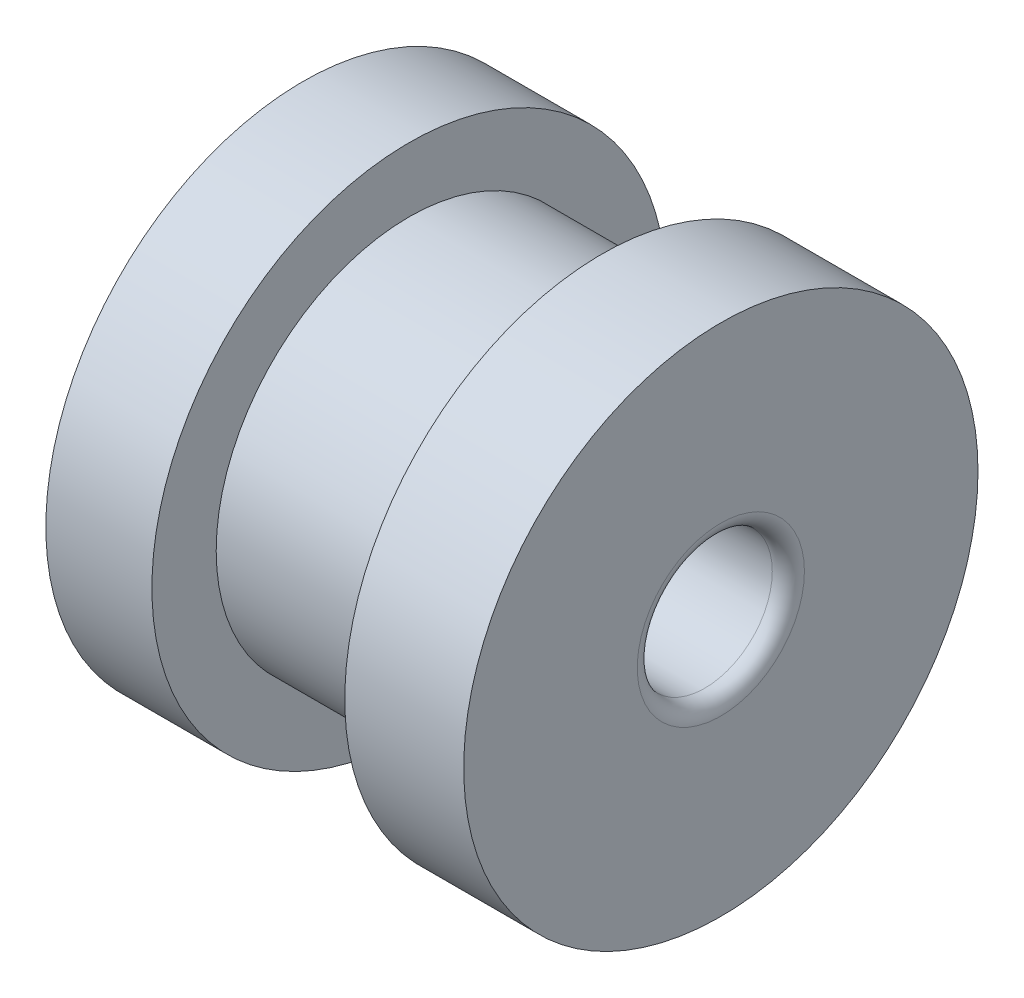
ISO-10303-21;
HEADER;
FILE_DESCRIPTION(('STEP AP214'),'2;1');
FILE_NAME('part.step','',(''),(''),'','','');
FILE_SCHEMA(('AUTOMOTIVE_DESIGN { 1 0 10303 214 1 1 1 1 }'));
ENDSEC;
DATA;
#1=APPLICATION_CONTEXT('core data for automotive mechanical design processes');
#2=APPLICATION_PROTOCOL_DEFINITION('international standard','automotive_design',2000,#1);
#3=PRODUCT_CONTEXT('',#1,'mechanical');
#4=PRODUCT('Part','Part','',(#3));
#5=PRODUCT_RELATED_PRODUCT_CATEGORY('part','',(#4));
#6=PRODUCT_DEFINITION_FORMATION('','',#4);
#7=PRODUCT_DEFINITION_CONTEXT('part definition',#1,'design');
#8=PRODUCT_DEFINITION('design','',#6,#7);
#9=PRODUCT_DEFINITION_SHAPE('','',#8);
#10=(LENGTH_UNIT() NAMED_UNIT(*) SI_UNIT(.MILLI.,.METRE.));
#11=(NAMED_UNIT(*) PLANE_ANGLE_UNIT() SI_UNIT($,.RADIAN.));
#12=(NAMED_UNIT(*) SI_UNIT($,.STERADIAN.) SOLID_ANGLE_UNIT());
#13=UNCERTAINTY_MEASURE_WITH_UNIT(LENGTH_MEASURE(1.E-05),#10,'distance_accuracy_value','');
#14=(GEOMETRIC_REPRESENTATION_CONTEXT(3) GLOBAL_UNCERTAINTY_ASSIGNED_CONTEXT((#13)) GLOBAL_UNIT_ASSIGNED_CONTEXT((#10,
#11,#12)) REPRESENTATION_CONTEXT('',''));
#15=CARTESIAN_POINT('',(0.,0.,0.));
#16=DIRECTION('',(0.,0.,1.));
#17=DIRECTION('',(1.,0.,0.));
#18=AXIS2_PLACEMENT_3D('',#15,#16,#17);
#19=CARTESIAN_POINT('',(-13.,0.,0.));
#20=DIRECTION('',(1.,0.,0.));
#21=DIRECTION('',(0.,0.,-1.));
#22=AXIS2_PLACEMENT_3D('',#19,#20,#21);
#23=CYLINDRICAL_SURFACE('',#22,8.);
#24=CARTESIAN_POINT('',(-13.,0.,0.));
#25=DIRECTION('',(1.,0.,0.));
#26=DIRECTION('',(0.,0.,-1.));
#27=AXIS2_PLACEMENT_3D('',#24,#25,#26);
#28=CIRCLE('',#27,8.);
#29=CARTESIAN_POINT('',(-13.,0.,-8.));
#30=VERTEX_POINT('',#29);
#31=EDGE_CURVE('E49',#30,#30,#28,.T.);
#32=CARTESIAN_POINT('',(-9.7,0.,0.));
#33=DIRECTION('',(-1.,0.,0.));
#34=DIRECTION('',(0.,0.,1.));
#35=AXIS2_PLACEMENT_3D('',#32,#33,#34);
#36=CIRCLE('',#35,8.);
#37=CARTESIAN_POINT('',(-9.7,0.,-8.));
#38=VERTEX_POINT('',#37);
#39=EDGE_CURVE('E64',#38,#38,#36,.T.);
#40=CARTESIAN_POINT('',(-13.,0.,-8.));
#41=CARTESIAN_POINT('',(-12.965625,0.,-8.));
#42=CARTESIAN_POINT('',(-12.93125,0.,-8.));
#43=CARTESIAN_POINT('',(-12.8625,0.,-8.));
#44=CARTESIAN_POINT('',(-12.828125,0.,-8.));
#45=CARTESIAN_POINT('',(-12.759375,0.,-8.));
#46=CARTESIAN_POINT('',(-12.725,0.,-8.));
#47=CARTESIAN_POINT('',(-12.65625,0.,-8.));
#48=CARTESIAN_POINT('',(-12.621875,0.,-8.));
#49=CARTESIAN_POINT('',(-12.553125,0.,-8.));
#50=CARTESIAN_POINT('',(-12.51875,0.,-8.));
#51=CARTESIAN_POINT('',(-12.45,0.,-8.));
#52=CARTESIAN_POINT('',(-12.415625,0.,-8.));
#53=CARTESIAN_POINT('',(-12.346875,0.,-8.));
#54=CARTESIAN_POINT('',(-12.3125,0.,-8.));
#55=CARTESIAN_POINT('',(-12.24375,0.,-8.));
#56=CARTESIAN_POINT('',(-12.209375,0.,-8.));
#57=CARTESIAN_POINT('',(-12.140625,0.,-8.));
#58=CARTESIAN_POINT('',(-12.10625,0.,-8.));
#59=CARTESIAN_POINT('',(-12.0375,0.,-8.));
#60=CARTESIAN_POINT('',(-12.003125,0.,-8.));
#61=CARTESIAN_POINT('',(-11.934375,0.,-8.));
#62=CARTESIAN_POINT('',(-11.9,0.,-8.));
#63=CARTESIAN_POINT('',(-11.83125,0.,-8.));
#64=CARTESIAN_POINT('',(-11.796875,0.,-8.));
#65=CARTESIAN_POINT('',(-11.728125,0.,-8.));
#66=CARTESIAN_POINT('',(-11.69375,0.,-8.));
#67=CARTESIAN_POINT('',(-11.625,0.,-8.));
#68=CARTESIAN_POINT('',(-11.590625,0.,-8.));
#69=CARTESIAN_POINT('',(-11.521875,0.,-8.));
#70=CARTESIAN_POINT('',(-11.4875,0.,-8.));
#71=CARTESIAN_POINT('',(-11.41875,0.,-8.));
#72=CARTESIAN_POINT('',(-11.384375,0.,-8.));
#73=CARTESIAN_POINT('',(-11.315625,0.,-8.));
#74=CARTESIAN_POINT('',(-11.28125,0.,-8.));
#75=CARTESIAN_POINT('',(-11.2125,0.,-8.));
#76=CARTESIAN_POINT('',(-11.178125,0.,-8.));
#77=CARTESIAN_POINT('',(-11.109375,0.,-8.));
#78=CARTESIAN_POINT('',(-11.075,0.,-8.));
#79=CARTESIAN_POINT('',(-11.00625,0.,-8.));
#80=CARTESIAN_POINT('',(-10.971875,0.,-8.));
#81=CARTESIAN_POINT('',(-10.903125,0.,-8.));
#82=CARTESIAN_POINT('',(-10.86875,0.,-8.));
#83=CARTESIAN_POINT('',(-10.8,0.,-8.));
#84=CARTESIAN_POINT('',(-10.765625,0.,-8.));
#85=CARTESIAN_POINT('',(-10.696875,0.,-8.));
#86=CARTESIAN_POINT('',(-10.6625,0.,-8.));
#87=CARTESIAN_POINT('',(-10.59375,0.,-8.));
#88=CARTESIAN_POINT('',(-10.559375,0.,-8.));
#89=CARTESIAN_POINT('',(-10.490625,0.,-8.));
#90=CARTESIAN_POINT('',(-10.45625,0.,-8.));
#91=CARTESIAN_POINT('',(-10.3875,0.,-8.));
#92=CARTESIAN_POINT('',(-10.353125,0.,-8.));
#93=CARTESIAN_POINT('',(-10.284375,0.,-8.));
#94=CARTESIAN_POINT('',(-10.25,0.,-8.));
#95=CARTESIAN_POINT('',(-10.18125,0.,-8.));
#96=CARTESIAN_POINT('',(-10.146875,0.,-8.));
#97=CARTESIAN_POINT('',(-10.078125,0.,-8.));
#98=CARTESIAN_POINT('',(-10.04375,0.,-8.));
#99=CARTESIAN_POINT('',(-9.975,0.,-8.));
#100=CARTESIAN_POINT('',(-9.940625,0.,-8.));
#101=CARTESIAN_POINT('',(-9.871875,0.,-8.));
#102=CARTESIAN_POINT('',(-9.8375,0.,-8.));
#103=CARTESIAN_POINT('',(-9.76875,0.,-8.));
#104=CARTESIAN_POINT('',(-9.734375,0.,-8.));
#105=CARTESIAN_POINT('',(-9.7,0.,-8.));
#106=B_SPLINE_CURVE_WITH_KNOTS('',3,(#40,#41,#42,#43,#44,#45,#46,#47,#48,#49,#50,#51,#52,#53,
#54,#55,#56,#57,#58,#59,#60,#61,#62,#63,#64,#65,#66,#67,#68,#69,#70,#71,#72,#73,#74,#75,#76,#77,
#78,#79,#80,#81,#82,#83,#84,#85,#86,#87,#88,#89,#90,#91,#92,#93,#94,#95,#96,#97,#98,#99,#100,
#101,#102,#103,#104,#105),.UNSPECIFIED.,.F.,.F.,(4,2,2,2,2,2,2,2,2,2,2,2,2,2,2,2,2,2,2,2,2,2,2,
2,2,2,2,2,2,2,2,2,4),(0.,0.103124999999999,0.20625,0.309374999999999,0.4125,0.515624999999999,
0.618749999999999,0.721874999999999,0.824999999999999,0.928125,1.03125,1.134375,1.2375,1.340625,
1.44375,1.546875,1.65,1.753125,1.85625,1.959375,2.0625,2.165625,2.26875,2.371875,2.475,2.578125,
2.68125,2.784375,2.8875,2.990625,3.09375,3.196875,3.3),.UNSPECIFIED.);
#107=EDGE_CURVE('BSEAM29',#30,#38,#106,.T.);
#108=ORIENTED_EDGE('',*,*,#31,.T.);
#109=ORIENTED_EDGE('',*,*,#39,.T.);
#110=ORIENTED_EDGE('',*,*,#107,.T.);
#111=ORIENTED_EDGE('',*,*,#107,.F.);
#112=EDGE_LOOP('',(#108,#110,#109,#111));
#113=FACE_BOUND('',#112,.T.);
#114=ADVANCED_FACE('F29',(#113),#23,.T.);
#115=CARTESIAN_POINT('',(0.,0.,0.));
#116=DIRECTION('',(1.,0.,0.));
#117=DIRECTION('',(0.,0.,-1.));
#118=AXIS2_PLACEMENT_3D('',#115,#116,#117);
#119=CIRCLE('',#118,8.);
#120=CARTESIAN_POINT('',(0.,0.,-8.));
#121=VERTEX_POINT('',#120);
#122=EDGE_CURVE('E50',#121,#121,#119,.T.);
#123=CARTESIAN_POINT('',(-3.7,0.,0.));
#124=DIRECTION('',(-1.,0.,0.));
#125=DIRECTION('',(0.,0.,1.));
#126=AXIS2_PLACEMENT_3D('',#123,#124,#125);
#127=CIRCLE('',#126,8.);
#128=CARTESIAN_POINT('',(-3.7,0.,-8.));
#129=VERTEX_POINT('',#128);
#130=EDGE_CURVE('E61',#129,#129,#127,.T.);
#131=CARTESIAN_POINT('',(0.,0.,-8.));
#132=CARTESIAN_POINT('',(-0.0385416666666665,0.,-8.));
#133=CARTESIAN_POINT('',(-0.0770833333333329,0.,-8.));
#134=CARTESIAN_POINT('',(-0.154166666666666,0.,-8.));
#135=CARTESIAN_POINT('',(-0.192708333333334,0.,-8.));
#136=CARTESIAN_POINT('',(-0.269791666666667,0.,-8.));
#137=CARTESIAN_POINT('',(-0.308333333333334,0.,-8.));
#138=CARTESIAN_POINT('',(-0.385416666666666,0.,-8.));
#139=CARTESIAN_POINT('',(-0.423958333333333,0.,-8.));
#140=CARTESIAN_POINT('',(-0.501041666666666,0.,-8.));
#141=CARTESIAN_POINT('',(-0.539583333333333,0.,-8.));
#142=CARTESIAN_POINT('',(-0.616666666666667,0.,-8.));
#143=CARTESIAN_POINT('',(-0.655208333333334,0.,-8.));
#144=CARTESIAN_POINT('',(-0.732291666666666,0.,-8.));
#145=CARTESIAN_POINT('',(-0.770833333333333,0.,-8.));
#146=CARTESIAN_POINT('',(-0.847916666666666,0.,-8.));
#147=CARTESIAN_POINT('',(-0.886458333333332,0.,-8.));
#148=CARTESIAN_POINT('',(-0.963541666666666,0.,-8.));
#149=CARTESIAN_POINT('',(-1.00208333333333,0.,-8.));
#150=CARTESIAN_POINT('',(-1.07916666666667,0.,-8.));
#151=CARTESIAN_POINT('',(-1.11770833333333,0.,-8.));
#152=CARTESIAN_POINT('',(-1.19479166666667,0.,-8.));
#153=CARTESIAN_POINT('',(-1.23333333333333,0.,-8.));
#154=CARTESIAN_POINT('',(-1.31041666666667,0.,-8.));
#155=CARTESIAN_POINT('',(-1.34895833333333,0.,-8.));
#156=CARTESIAN_POINT('',(-1.42604166666667,0.,-8.));
#157=CARTESIAN_POINT('',(-1.46458333333333,0.,-8.));
#158=CARTESIAN_POINT('',(-1.54166666666667,0.,-8.));
#159=CARTESIAN_POINT('',(-1.58020833333333,0.,-8.));
#160=CARTESIAN_POINT('',(-1.65729166666667,0.,-8.));
#161=CARTESIAN_POINT('',(-1.69583333333333,0.,-8.));
#162=CARTESIAN_POINT('',(-1.77291666666667,0.,-8.));
#163=CARTESIAN_POINT('',(-1.81145833333333,0.,-8.));
#164=CARTESIAN_POINT('',(-1.88854166666667,0.,-8.));
#165=CARTESIAN_POINT('',(-1.92708333333333,0.,-8.));
#166=CARTESIAN_POINT('',(-2.00416666666667,0.,-8.));
#167=CARTESIAN_POINT('',(-2.04270833333333,0.,-8.));
#168=CARTESIAN_POINT('',(-2.11979166666667,0.,-8.));
#169=CARTESIAN_POINT('',(-2.15833333333333,0.,-8.));
#170=CARTESIAN_POINT('',(-2.23541666666667,0.,-8.));
#171=CARTESIAN_POINT('',(-2.27395833333333,0.,-8.));
#172=CARTESIAN_POINT('',(-2.35104166666667,0.,-8.));
#173=CARTESIAN_POINT('',(-2.38958333333333,0.,-8.));
#174=CARTESIAN_POINT('',(-2.46666666666667,0.,-8.));
#175=CARTESIAN_POINT('',(-2.50520833333333,0.,-8.));
#176=CARTESIAN_POINT('',(-2.58229166666667,0.,-8.));
#177=CARTESIAN_POINT('',(-2.62083333333333,0.,-8.));
#178=CARTESIAN_POINT('',(-2.69791666666667,0.,-8.));
#179=CARTESIAN_POINT('',(-2.73645833333333,0.,-8.));
#180=CARTESIAN_POINT('',(-2.81354166666667,0.,-8.));
#181=CARTESIAN_POINT('',(-2.85208333333333,0.,-8.));
#182=CARTESIAN_POINT('',(-2.92916666666667,0.,-8.));
#183=CARTESIAN_POINT('',(-2.96770833333333,0.,-8.));
#184=CARTESIAN_POINT('',(-3.04479166666667,0.,-8.));
#185=CARTESIAN_POINT('',(-3.08333333333333,0.,-8.));
#186=CARTESIAN_POINT('',(-3.16041666666667,0.,-8.));
#187=CARTESIAN_POINT('',(-3.19895833333333,0.,-8.));
#188=CARTESIAN_POINT('',(-3.27604166666667,0.,-8.));
#189=CARTESIAN_POINT('',(-3.31458333333333,0.,-8.));
#190=CARTESIAN_POINT('',(-3.39166666666667,0.,-8.));
#191=CARTESIAN_POINT('',(-3.43020833333333,0.,-8.));
#192=CARTESIAN_POINT('',(-3.50729166666667,0.,-8.));
#193=CARTESIAN_POINT('',(-3.54583333333333,0.,-8.));
#194=CARTESIAN_POINT('',(-3.62291666666667,0.,-8.));
#195=CARTESIAN_POINT('',(-3.66145833333333,0.,-8.));
#196=CARTESIAN_POINT('',(-3.7,0.,-8.));
#197=B_SPLINE_CURVE_WITH_KNOTS('',3,(#131,#132,#133,#134,#135,#136,#137,#138,#139,#140,#141,
#142,#143,#144,#145,#146,#147,#148,#149,#150,#151,#152,#153,#154,#155,#156,#157,#158,#159,#160,
#161,#162,#163,#164,#165,#166,#167,#168,#169,#170,#171,#172,#173,#174,#175,#176,#177,#178,#179,
#180,#181,#182,#183,#184,#185,#186,#187,#188,#189,#190,#191,#192,#193,#194,#195,#196),
.UNSPECIFIED.,.F.,.F.,(4,2,2,2,2,2,2,2,2,2,2,2,2,2,2,2,2,2,2,2,2,2,2,2,2,2,2,2,2,2,2,2,4),(0.,
0.115624999999999,0.231250000000001,0.346875,0.462499999999999,0.578125000000001,0.69375,
0.809374999999999,0.924999999999999,1.040625,1.15625,1.271875,1.3875,1.503125,1.61875,1.734375,
1.85,1.965625,2.08125,2.196875,2.3125,2.428125,2.54375,2.659375,2.775,2.890625,3.00625,3.121875,
3.2375,3.353125,3.46875,3.584375,3.7),.UNSPECIFIED.);
#198=EDGE_CURVE('BSEAM85',#121,#129,#197,.T.);
#199=ORIENTED_EDGE('',*,*,#122,.F.);
#200=ORIENTED_EDGE('',*,*,#130,.F.);
#201=ORIENTED_EDGE('',*,*,#198,.T.);
#202=ORIENTED_EDGE('',*,*,#198,.F.);
#203=EDGE_LOOP('',(#199,#201,#200,#202));
#204=FACE_BOUND('',#203,.T.);
#205=ADVANCED_FACE('F85',(#204),#23,.T.);
#206=CARTESIAN_POINT('',(-13.,0.,0.));
#207=DIRECTION('',(1.,0.,0.));
#208=DIRECTION('',(0.,0.,-1.));
#209=AXIS2_PLACEMENT_3D('',#206,#207,#208);
#210=PLANE('',#209);
#211=CARTESIAN_POINT('',(-13.,0.,0.));
#212=DIRECTION('',(1.,0.,0.));
#213=DIRECTION('',(0.,0.,-1.));
#214=AXIS2_PLACEMENT_3D('',#211,#212,#213);
#215=CIRCLE('',#214,2.6);
#216=CARTESIAN_POINT('',(-13.,0.,-2.6));
#217=VERTEX_POINT('',#216);
#218=EDGE_CURVE('E10',#217,#217,#215,.T.);
#219=ORIENTED_EDGE('',*,*,#218,.T.);
#220=EDGE_LOOP('',(#219));
#221=FACE_BOUND('',#220,.T.);
#222=ORIENTED_EDGE('',*,*,#31,.F.);
#223=EDGE_LOOP('',(#222));
#224=FACE_BOUND('',#223,.T.);
#225=ADVANCED_FACE('F91',(#221,#224),#210,.F.);
#226=CARTESIAN_POINT('',(0.,0.,0.));
#227=DIRECTION('',(1.,0.,0.));
#228=DIRECTION('',(0.,0.,-1.));
#229=AXIS2_PLACEMENT_3D('',#226,#227,#228);
#230=PLANE('',#229);
#231=CARTESIAN_POINT('',(0.,0.,0.));
#232=DIRECTION('',(1.,0.,0.));
#233=DIRECTION('',(0.,0.,-1.));
#234=AXIS2_PLACEMENT_3D('',#231,#232,#233);
#235=CIRCLE('',#234,2.6);
#236=CARTESIAN_POINT('',(0.,0.,-2.6));
#237=VERTEX_POINT('',#236);
#238=EDGE_CURVE('E36',#237,#237,#235,.F.);
#239=ORIENTED_EDGE('',*,*,#238,.T.);
#240=EDGE_LOOP('',(#239));
#241=FACE_BOUND('',#240,.T.);
#242=ORIENTED_EDGE('',*,*,#122,.T.);
#243=EDGE_LOOP('',(#242));
#244=FACE_BOUND('',#243,.T.);
#245=ADVANCED_FACE('F94',(#241,#244),#230,.T.);
#246=CARTESIAN_POINT('',(-13.,0.,0.));
#247=DIRECTION('',(1.,0.,0.));
#248=DIRECTION('',(0.,0.,-1.));
#249=AXIS2_PLACEMENT_3D('',#246,#247,#248);
#250=CYLINDRICAL_SURFACE('',#249,2.1);
#251=CARTESIAN_POINT('',(-0.5,0.,0.));
#252=DIRECTION('',(1.,0.,0.));
#253=DIRECTION('',(0.,0.,-1.));
#254=AXIS2_PLACEMENT_3D('',#251,#252,#253);
#255=CIRCLE('',#254,2.1);
#256=CARTESIAN_POINT('',(-0.5,0.,-2.1));
#257=VERTEX_POINT('',#256);
#258=EDGE_CURVE('E40',#257,#257,#255,.T.);
#259=CARTESIAN_POINT('',(-12.5,0.,0.));
#260=DIRECTION('',(1.,0.,0.));
#261=DIRECTION('',(0.,0.,-1.));
#262=AXIS2_PLACEMENT_3D('',#259,#260,#261);
#263=CIRCLE('',#262,2.1);
#264=CARTESIAN_POINT('',(-12.5,0.,-2.1));
#265=VERTEX_POINT('',#264);
#266=EDGE_CURVE('E44',#265,#265,#263,.F.);
#267=CARTESIAN_POINT('',(-0.5,0.,-2.1));
#268=CARTESIAN_POINT('',(-0.625000000000001,0.,-2.1));
#269=CARTESIAN_POINT('',(-0.750000000000001,0.,-2.1));
#270=CARTESIAN_POINT('',(-1.,0.,-2.1));
#271=CARTESIAN_POINT('',(-1.125,0.,-2.1));
#272=CARTESIAN_POINT('',(-1.375,0.,-2.1));
#273=CARTESIAN_POINT('',(-1.5,0.,-2.1));
#274=CARTESIAN_POINT('',(-1.75,0.,-2.1));
#275=CARTESIAN_POINT('',(-1.875,0.,-2.1));
#276=CARTESIAN_POINT('',(-2.125,0.,-2.1));
#277=CARTESIAN_POINT('',(-2.25,0.,-2.1));
#278=CARTESIAN_POINT('',(-2.5,0.,-2.1));
#279=CARTESIAN_POINT('',(-2.625,0.,-2.1));
#280=CARTESIAN_POINT('',(-2.875,0.,-2.1));
#281=CARTESIAN_POINT('',(-3.,0.,-2.1));
#282=CARTESIAN_POINT('',(-3.25,0.,-2.1));
#283=CARTESIAN_POINT('',(-3.375,0.,-2.1));
#284=CARTESIAN_POINT('',(-3.625,0.,-2.1));
#285=CARTESIAN_POINT('',(-3.75,0.,-2.1));
#286=CARTESIAN_POINT('',(-4.,0.,-2.1));
#287=CARTESIAN_POINT('',(-4.125,0.,-2.1));
#288=CARTESIAN_POINT('',(-4.375,0.,-2.1));
#289=CARTESIAN_POINT('',(-4.5,0.,-2.1));
#290=CARTESIAN_POINT('',(-4.75,0.,-2.1));
#291=CARTESIAN_POINT('',(-4.875,0.,-2.1));
#292=CARTESIAN_POINT('',(-5.125,0.,-2.1));
#293=CARTESIAN_POINT('',(-5.25,0.,-2.1));
#294=CARTESIAN_POINT('',(-5.5,0.,-2.1));
#295=CARTESIAN_POINT('',(-5.625,0.,-2.1));
#296=CARTESIAN_POINT('',(-5.875,0.,-2.1));
#297=CARTESIAN_POINT('',(-6.,0.,-2.1));
#298=CARTESIAN_POINT('',(-6.25,0.,-2.1));
#299=CARTESIAN_POINT('',(-6.375,0.,-2.1));
#300=CARTESIAN_POINT('',(-6.625,0.,-2.1));
#301=CARTESIAN_POINT('',(-6.75,0.,-2.1));
#302=CARTESIAN_POINT('',(-7.,0.,-2.1));
#303=CARTESIAN_POINT('',(-7.125,0.,-2.1));
#304=CARTESIAN_POINT('',(-7.375,0.,-2.1));
#305=CARTESIAN_POINT('',(-7.5,0.,-2.1));
#306=CARTESIAN_POINT('',(-7.75,0.,-2.1));
#307=CARTESIAN_POINT('',(-7.875,0.,-2.1));
#308=CARTESIAN_POINT('',(-8.125,0.,-2.1));
#309=CARTESIAN_POINT('',(-8.25,0.,-2.1));
#310=CARTESIAN_POINT('',(-8.5,0.,-2.1));
#311=CARTESIAN_POINT('',(-8.625,0.,-2.1));
#312=CARTESIAN_POINT('',(-8.875,0.,-2.1));
#313=CARTESIAN_POINT('',(-9.,0.,-2.1));
#314=CARTESIAN_POINT('',(-9.25,0.,-2.1));
#315=CARTESIAN_POINT('',(-9.375,0.,-2.1));
#316=CARTESIAN_POINT('',(-9.625,0.,-2.1));
#317=CARTESIAN_POINT('',(-9.75,0.,-2.1));
#318=CARTESIAN_POINT('',(-10.,0.,-2.1));
#319=CARTESIAN_POINT('',(-10.125,0.,-2.1));
#320=CARTESIAN_POINT('',(-10.375,0.,-2.1));
#321=CARTESIAN_POINT('',(-10.5,0.,-2.1));
#322=CARTESIAN_POINT('',(-10.75,0.,-2.1));
#323=CARTESIAN_POINT('',(-10.875,0.,-2.1));
#324=CARTESIAN_POINT('',(-11.125,0.,-2.1));
#325=CARTESIAN_POINT('',(-11.25,0.,-2.1));
#326=CARTESIAN_POINT('',(-11.5,0.,-2.1));
#327=CARTESIAN_POINT('',(-11.625,0.,-2.1));
#328=CARTESIAN_POINT('',(-11.875,0.,-2.1));
#329=CARTESIAN_POINT('',(-12.,0.,-2.1));
#330=CARTESIAN_POINT('',(-12.25,0.,-2.1));
#331=CARTESIAN_POINT('',(-12.375,0.,-2.1));
#332=CARTESIAN_POINT('',(-12.5,0.,-2.1));
#333=B_SPLINE_CURVE_WITH_KNOTS('',3,(#267,#268,#269,#270,#271,#272,#273,#274,#275,#276,#277,
#278,#279,#280,#281,#282,#283,#284,#285,#286,#287,#288,#289,#290,#291,#292,#293,#294,#295,#296,
#297,#298,#299,#300,#301,#302,#303,#304,#305,#306,#307,#308,#309,#310,#311,#312,#313,#314,#315,
#316,#317,#318,#319,#320,#321,#322,#323,#324,#325,#326,#327,#328,#329,#330,#331,#332),
.UNSPECIFIED.,.F.,.F.,(4,2,2,2,2,2,2,2,2,2,2,2,2,2,2,2,2,2,2,2,2,2,2,2,2,2,2,2,2,2,2,2,4),(0.,
0.375,0.750000000000001,1.125,1.5,1.875,2.25,2.625,3.,3.375,3.75,4.125,4.5,4.875,5.25,5.625,6.,
6.375,6.75,7.125,7.5,7.875,8.25,8.625,9.,9.375,9.75,10.125,10.5,10.875,11.25,11.625,12.),.UNSPECIFIED.);
#334=EDGE_CURVE('BSEAM97',#257,#265,#333,.T.);
#335=ORIENTED_EDGE('',*,*,#258,.T.);
#336=ORIENTED_EDGE('',*,*,#266,.T.);
#337=ORIENTED_EDGE('',*,*,#334,.T.);
#338=ORIENTED_EDGE('',*,*,#334,.F.);
#339=EDGE_LOOP('',(#335,#337,#336,#338));
#340=FACE_BOUND('',#339,.T.);
#341=ADVANCED_FACE('F97',(#340),#250,.F.);
#342=CARTESIAN_POINT('',(-0.5,0.,0.));
#343=DIRECTION('',(1.,0.,0.));
#344=DIRECTION('',(0.,0.,-1.));
#345=AXIS2_PLACEMENT_3D('',#342,#343,#344);
#346=TOROIDAL_SURFACE('',#345,2.6,0.5);
#347=ORIENTED_EDGE('',*,*,#238,.F.);
#348=EDGE_LOOP('',(#347));
#349=FACE_BOUND('',#348,.T.);
#350=ORIENTED_EDGE('',*,*,#258,.F.);
#351=EDGE_LOOP('',(#350));
#352=FACE_BOUND('',#351,.T.);
#353=ADVANCED_FACE('F81',(#349,#352),#346,.T.);
#354=CARTESIAN_POINT('',(-12.5,0.,0.));
#355=DIRECTION('',(1.,0.,0.));
#356=DIRECTION('',(0.,0.,-1.));
#357=AXIS2_PLACEMENT_3D('',#354,#355,#356);
#358=TOROIDAL_SURFACE('',#357,2.6,0.5);
#359=ORIENTED_EDGE('',*,*,#266,.F.);
#360=EDGE_LOOP('',(#359));
#361=FACE_BOUND('',#360,.T.);
#362=ORIENTED_EDGE('',*,*,#218,.F.);
#363=EDGE_LOOP('',(#362));
#364=FACE_BOUND('',#363,.T.);
#365=ADVANCED_FACE('F31',(#361,#364),#358,.T.);
#366=CARTESIAN_POINT('',(-9.7,8.,0.));
#367=DIRECTION('',(1.,0.,0.));
#368=DIRECTION('',(0.,0.,-1.));
#369=AXIS2_PLACEMENT_3D('',#366,#367,#368);
#370=PLANE('',#369);
#371=CARTESIAN_POINT('',(-9.7,0.,0.));
#372=DIRECTION('',(-1.,0.,0.));
#373=DIRECTION('',(0.,0.,1.));
#374=AXIS2_PLACEMENT_3D('',#371,#372,#373);
#375=CIRCLE('',#374,6.);
#376=CARTESIAN_POINT('',(-9.7,0.,6.));
#377=VERTEX_POINT('',#376);
#378=EDGE_CURVE('E53',#377,#377,#375,.T.);
#379=ORIENTED_EDGE('',*,*,#378,.T.);
#380=EDGE_LOOP('',(#379));
#381=FACE_BOUND('',#380,.T.);
#382=ORIENTED_EDGE('',*,*,#39,.F.);
#383=EDGE_LOOP('',(#382));
#384=FACE_BOUND('',#383,.T.);
#385=ADVANCED_FACE('F69',(#381,#384),#370,.T.);
#386=CARTESIAN_POINT('',(-13.,0.,0.));
#387=DIRECTION('',(-1.,0.,0.));
#388=DIRECTION('',(0.,0.,1.));
#389=AXIS2_PLACEMENT_3D('',#386,#387,#388);
#390=CYLINDRICAL_SURFACE('',#389,6.);
#391=CARTESIAN_POINT('',(-3.7,0.,0.));
#392=DIRECTION('',(-1.,0.,0.));
#393=DIRECTION('',(0.,0.,1.));
#394=AXIS2_PLACEMENT_3D('',#391,#392,#393);
#395=CIRCLE('',#394,6.);
#396=CARTESIAN_POINT('',(-3.7,0.,6.));
#397=VERTEX_POINT('',#396);
#398=EDGE_CURVE('E58',#397,#397,#395,.T.);
#399=ORIENTED_EDGE('',*,*,#398,.T.);
#400=EDGE_LOOP('',(#399));
#401=FACE_BOUND('',#400,.T.);
#402=ORIENTED_EDGE('',*,*,#378,.F.);
#403=EDGE_LOOP('',(#402));
#404=FACE_BOUND('',#403,.T.);
#405=ADVANCED_FACE('F71',(#401,#404),#390,.T.);
#406=CARTESIAN_POINT('',(-3.7,8.,0.));
#407=DIRECTION('',(-1.,0.,0.));
#408=DIRECTION('',(0.,0.,1.));
#409=AXIS2_PLACEMENT_3D('',#406,#407,#408);
#410=PLANE('',#409);
#411=ORIENTED_EDGE('',*,*,#130,.T.);
#412=EDGE_LOOP('',(#411));
#413=FACE_BOUND('',#412,.T.);
#414=ORIENTED_EDGE('',*,*,#398,.F.);
#415=EDGE_LOOP('',(#414));
#416=FACE_BOUND('',#415,.T.);
#417=ADVANCED_FACE('F78',(#413,#416),#410,.T.);
#418=CLOSED_SHELL('',(#114,#205,#225,#245,#341,#353,#365,#385,#405,#417));
#419=MANIFOLD_SOLID_BREP('B2',#418);
#420=ADVANCED_BREP_SHAPE_REPRESENTATION('',(#18,#419),#14);
#421=SHAPE_DEFINITION_REPRESENTATION(#9,#420);
ENDSEC;
END-ISO-10303-21;
